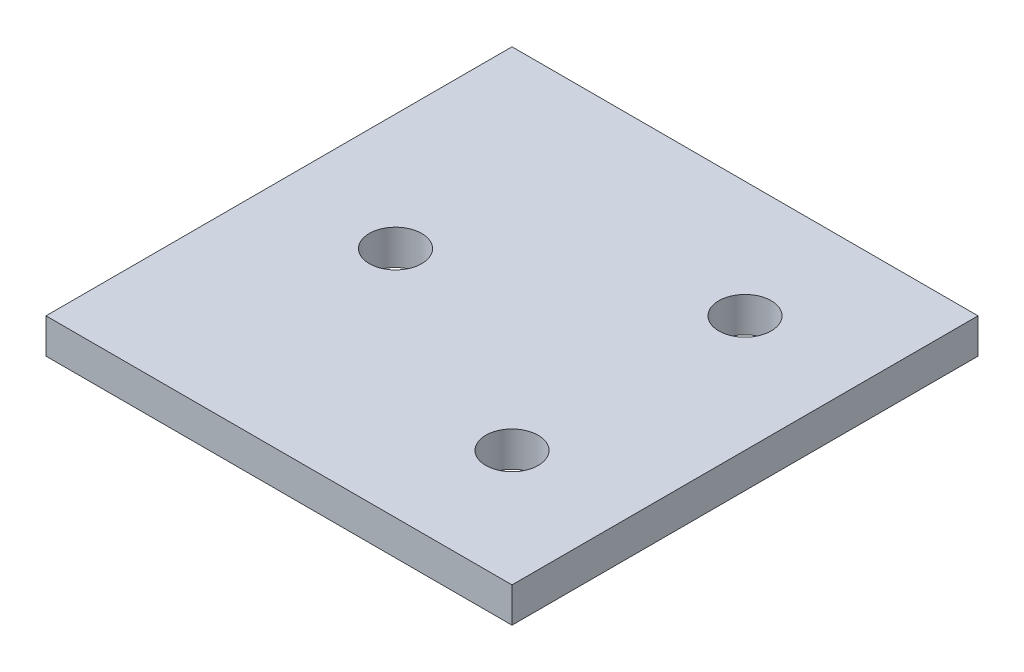
ISO-10303-21;
HEADER;
FILE_DESCRIPTION(('STEP AP214'),'2;1');
FILE_NAME('part.step','',(''),(''),'','','');
FILE_SCHEMA(('AUTOMOTIVE_DESIGN { 1 0 10303 214 1 1 1 1 }'));
ENDSEC;
DATA;
#1=APPLICATION_CONTEXT('core data for automotive mechanical design processes');
#2=APPLICATION_PROTOCOL_DEFINITION('international standard','automotive_design',2000,#1);
#3=PRODUCT_CONTEXT('',#1,'mechanical');
#4=PRODUCT('Part','Part','',(#3));
#5=PRODUCT_RELATED_PRODUCT_CATEGORY('part','',(#4));
#6=PRODUCT_DEFINITION_FORMATION('','',#4);
#7=PRODUCT_DEFINITION_CONTEXT('part definition',#1,'design');
#8=PRODUCT_DEFINITION('design','',#6,#7);
#9=PRODUCT_DEFINITION_SHAPE('','',#8);
#10=(LENGTH_UNIT() NAMED_UNIT(*) SI_UNIT(.MILLI.,.METRE.));
#11=(NAMED_UNIT(*) PLANE_ANGLE_UNIT() SI_UNIT($,.RADIAN.));
#12=(NAMED_UNIT(*) SI_UNIT($,.STERADIAN.) SOLID_ANGLE_UNIT());
#13=UNCERTAINTY_MEASURE_WITH_UNIT(LENGTH_MEASURE(1.E-05),#10,'distance_accuracy_value','');
#14=(GEOMETRIC_REPRESENTATION_CONTEXT(3) GLOBAL_UNCERTAINTY_ASSIGNED_CONTEXT((#13)) GLOBAL_UNIT_ASSIGNED_CONTEXT((#10,
#11,#12)) REPRESENTATION_CONTEXT('',''));
#15=CARTESIAN_POINT('',(0.,0.,0.));
#16=DIRECTION('',(0.,0.,1.));
#17=DIRECTION('',(1.,0.,0.));
#18=AXIS2_PLACEMENT_3D('',#15,#16,#17);
#19=CARTESIAN_POINT('',(80.,0.003099999999904,0.));
#20=DIRECTION('',(0.,1.,0.));
#21=DIRECTION('',(0.,0.,1.));
#22=AXIS2_PLACEMENT_3D('',#19,#20,#21);
#23=PLANE('',#22);
#24=CARTESIAN_POINT('',(60.,0.003100000000018,60.));
#25=DIRECTION('',(0.,1.,0.));
#26=DIRECTION('',(0.,0.,1.));
#27=AXIS2_PLACEMENT_3D('',#24,#25,#26);
#28=CIRCLE('',#27,4.5);
#29=CARTESIAN_POINT('',(60.,0.003100000000018,64.5));
#30=VERTEX_POINT('',#29);
#31=EDGE_CURVE('E87',#30,#30,#28,.T.);
#32=ORIENTED_EDGE('',*,*,#31,.T.);
#33=EDGE_LOOP('',(#32));
#34=FACE_BOUND('',#33,.T.);
#35=CARTESIAN_POINT('',(20.,0.003100000000018,40.));
#36=DIRECTION('',(0.,1.,0.));
#37=DIRECTION('',(0.,0.,1.));
#38=AXIS2_PLACEMENT_3D('',#35,#36,#37);
#39=CIRCLE('',#38,4.5);
#40=CARTESIAN_POINT('',(20.,0.003100000000018,44.5));
#41=VERTEX_POINT('',#40);
#42=EDGE_CURVE('E90',#41,#41,#39,.T.);
#43=ORIENTED_EDGE('',*,*,#42,.T.);
#44=EDGE_LOOP('',(#43));
#45=FACE_BOUND('',#44,.T.);
#46=CARTESIAN_POINT('',(60.,0.003100000000018,20.));
#47=DIRECTION('',(0.,1.,0.));
#48=DIRECTION('',(0.,0.,1.));
#49=AXIS2_PLACEMENT_3D('',#46,#47,#48);
#50=CIRCLE('',#49,4.5);
#51=CARTESIAN_POINT('',(60.,0.003100000000018,24.5));
#52=VERTEX_POINT('',#51);
#53=EDGE_CURVE('E19',#52,#52,#50,.T.);
#54=ORIENTED_EDGE('',*,*,#53,.T.);
#55=EDGE_LOOP('',(#54));
#56=FACE_BOUND('',#55,.T.);
#57=DIRECTION('',(0.,0.,1.));
#58=VECTOR('',#57,1.);
#59=CARTESIAN_POINT('',(0.,0.003100000000018,0.));
#60=LINE('',#59,#58);
#61=CARTESIAN_POINT('',(0.,0.0030999999999895,0.));
#62=VERTEX_POINT('',#61);
#63=CARTESIAN_POINT('',(0.,0.003099999999961,80.));
#64=VERTEX_POINT('',#63);
#65=EDGE_CURVE('E61',#62,#64,#60,.T.);
#66=ORIENTED_EDGE('',*,*,#65,.F.);
#67=DIRECTION('',(1.,0.,0.));
#68=VECTOR('',#67,1.);
#69=CARTESIAN_POINT('',(80.,0.003100000000018,0.));
#70=LINE('',#69,#68);
#71=CARTESIAN_POINT('',(80.,0.003099999999961,0.));
#72=VERTEX_POINT('',#71);
#73=EDGE_CURVE('E55',#62,#72,#70,.T.);
#74=ORIENTED_EDGE('',*,*,#73,.T.);
#75=DIRECTION('',(0.,0.,1.));
#76=VECTOR('',#75,1.);
#77=CARTESIAN_POINT('',(80.,0.003100000000018,0.));
#78=LINE('',#77,#76);
#79=CARTESIAN_POINT('',(80.,0.003099999999961,80.));
#80=VERTEX_POINT('',#79);
#81=EDGE_CURVE('E59',#72,#80,#78,.T.);
#82=ORIENTED_EDGE('',*,*,#81,.T.);
#83=DIRECTION('',(1.,0.,0.));
#84=VECTOR('',#83,1.);
#85=CARTESIAN_POINT('',(80.,0.003100000000018,80.));
#86=LINE('',#85,#84);
#87=EDGE_CURVE('E99',#64,#80,#86,.T.);
#88=ORIENTED_EDGE('',*,*,#87,.F.);
#89=EDGE_LOOP('',(#66,#74,#82,#88));
#90=FACE_BOUND('',#89,.T.);
#91=ADVANCED_FACE('F16',(#34,#45,#56,#90),#23,.F.);
#92=CARTESIAN_POINT('',(80.,0.003099999999904,0.));
#93=DIRECTION('',(-1.,0.,0.));
#94=DIRECTION('',(0.,0.,1.));
#95=AXIS2_PLACEMENT_3D('',#92,#93,#94);
#96=PLANE('',#95);
#97=DIRECTION('',(0.,1.,0.));
#98=VECTOR('',#97,1.);
#99=CARTESIAN_POINT('',(80.,0.003099999999904,80.));
#100=LINE('',#99,#98);
#101=CARTESIAN_POINT('',(80.,6.0031,80.));
#102=VERTEX_POINT('',#101);
#103=EDGE_CURVE('E69',#80,#102,#100,.T.);
#104=ORIENTED_EDGE('',*,*,#103,.F.);
#105=ORIENTED_EDGE('',*,*,#81,.F.);
#106=DIRECTION('',(0.,1.,0.));
#107=VECTOR('',#106,1.);
#108=CARTESIAN_POINT('',(80.,0.003099999999904,0.));
#109=LINE('',#108,#107);
#110=CARTESIAN_POINT('',(80.,6.0031,0.));
#111=VERTEX_POINT('',#110);
#112=EDGE_CURVE('E63',#72,#111,#109,.T.);
#113=ORIENTED_EDGE('',*,*,#112,.T.);
#114=DIRECTION('',(0.,0.,1.));
#115=VECTOR('',#114,1.);
#116=CARTESIAN_POINT('',(80.,6.0031,0.));
#117=LINE('',#116,#115);
#118=EDGE_CURVE('E89',#102,#111,#117,.F.);
#119=ORIENTED_EDGE('',*,*,#118,.F.);
#120=EDGE_LOOP('',(#104,#105,#113,#119));
#121=FACE_BOUND('',#120,.T.);
#122=ADVANCED_FACE('F66',(#121),#96,.F.);
#123=CARTESIAN_POINT('',(80.,0.003099999999904,0.));
#124=DIRECTION('',(0.,0.,1.));
#125=DIRECTION('',(1.,0.,0.));
#126=AXIS2_PLACEMENT_3D('',#123,#124,#125);
#127=PLANE('',#126);
#128=DIRECTION('',(1.,0.,0.));
#129=VECTOR('',#128,1.);
#130=CARTESIAN_POINT('',(80.,6.0031,0.));
#131=LINE('',#130,#129);
#132=CARTESIAN_POINT('',(0.,6.0031,0.));
#133=VERTEX_POINT('',#132);
#134=EDGE_CURVE('E74',#111,#133,#131,.F.);
#135=ORIENTED_EDGE('',*,*,#134,.F.);
#136=ORIENTED_EDGE('',*,*,#112,.F.);
#137=ORIENTED_EDGE('',*,*,#73,.F.);
#138=DIRECTION('',(0.,1.,0.));
#139=VECTOR('',#138,1.);
#140=CARTESIAN_POINT('',(0.,0.003099999999904,0.));
#141=LINE('',#140,#139);
#142=EDGE_CURVE('E76',#133,#62,#141,.F.);
#143=ORIENTED_EDGE('',*,*,#142,.F.);
#144=EDGE_LOOP('',(#135,#136,#137,#143));
#145=FACE_BOUND('',#144,.T.);
#146=ADVANCED_FACE('F72',(#145),#127,.F.);
#147=CARTESIAN_POINT('',(0.,0.003099999999904,0.));
#148=DIRECTION('',(-1.,0.,0.));
#149=DIRECTION('',(0.,0.,1.));
#150=AXIS2_PLACEMENT_3D('',#147,#148,#149);
#151=PLANE('',#150);
#152=DIRECTION('',(0.,1.,0.));
#153=VECTOR('',#152,1.);
#154=CARTESIAN_POINT('',(0.,0.003099999999904,80.));
#155=LINE('',#154,#153);
#156=CARTESIAN_POINT('',(0.,6.0031,80.));
#157=VERTEX_POINT('',#156);
#158=EDGE_CURVE('E34',#157,#64,#155,.F.);
#159=ORIENTED_EDGE('',*,*,#158,.F.);
#160=DIRECTION('',(0.,0.,1.));
#161=VECTOR('',#160,1.);
#162=CARTESIAN_POINT('',(0.,6.0031,0.));
#163=LINE('',#162,#161);
#164=EDGE_CURVE('E106',#133,#157,#163,.T.);
#165=ORIENTED_EDGE('',*,*,#164,.F.);
#166=ORIENTED_EDGE('',*,*,#142,.T.);
#167=ORIENTED_EDGE('',*,*,#65,.T.);
#168=EDGE_LOOP('',(#159,#165,#166,#167));
#169=FACE_BOUND('',#168,.T.);
#170=ADVANCED_FACE('F104',(#169),#151,.T.);
#171=CARTESIAN_POINT('',(80.,0.003099999999904,80.));
#172=DIRECTION('',(0.,0.,1.));
#173=DIRECTION('',(1.,0.,0.));
#174=AXIS2_PLACEMENT_3D('',#171,#172,#173);
#175=PLANE('',#174);
#176=DIRECTION('',(1.,0.,0.));
#177=VECTOR('',#176,1.);
#178=CARTESIAN_POINT('',(80.,6.0031,80.));
#179=LINE('',#178,#177);
#180=EDGE_CURVE('E86',#157,#102,#179,.T.);
#181=ORIENTED_EDGE('',*,*,#180,.F.);
#182=ORIENTED_EDGE('',*,*,#158,.T.);
#183=ORIENTED_EDGE('',*,*,#87,.T.);
#184=ORIENTED_EDGE('',*,*,#103,.T.);
#185=EDGE_LOOP('',(#181,#182,#183,#184));
#186=FACE_BOUND('',#185,.T.);
#187=ADVANCED_FACE('F112',(#186),#175,.T.);
#188=CARTESIAN_POINT('',(60.,0.003099999999904,20.));
#189=DIRECTION('',(0.,1.,0.));
#190=DIRECTION('',(0.,0.,1.));
#191=AXIS2_PLACEMENT_3D('',#188,#189,#190);
#192=CYLINDRICAL_SURFACE('',#191,4.5);
#193=ORIENTED_EDGE('',*,*,#53,.F.);
#194=EDGE_LOOP('',(#193));
#195=FACE_BOUND('',#194,.T.);
#196=CARTESIAN_POINT('',(60.,6.0031,20.));
#197=DIRECTION('',(0.,1.,0.));
#198=DIRECTION('',(0.,0.,1.));
#199=AXIS2_PLACEMENT_3D('',#196,#197,#198);
#200=CIRCLE('',#199,4.5);
#201=CARTESIAN_POINT('',(60.,6.0031,24.5));
#202=VERTEX_POINT('',#201);
#203=EDGE_CURVE('E83',#202,#202,#200,.F.);
#204=ORIENTED_EDGE('',*,*,#203,.F.);
#205=EDGE_LOOP('',(#204));
#206=FACE_BOUND('',#205,.T.);
#207=ADVANCED_FACE('F114',(#195,#206),#192,.F.);
#208=CARTESIAN_POINT('',(20.,0.003099999999904,40.));
#209=DIRECTION('',(0.,1.,0.));
#210=DIRECTION('',(0.,0.,1.));
#211=AXIS2_PLACEMENT_3D('',#208,#209,#210);
#212=CYLINDRICAL_SURFACE('',#211,4.5);
#213=ORIENTED_EDGE('',*,*,#42,.F.);
#214=EDGE_LOOP('',(#213));
#215=FACE_BOUND('',#214,.T.);
#216=CARTESIAN_POINT('',(20.,6.0031,40.));
#217=DIRECTION('',(0.,1.,0.));
#218=DIRECTION('',(0.,0.,1.));
#219=AXIS2_PLACEMENT_3D('',#216,#217,#218);
#220=CIRCLE('',#219,4.5);
#221=CARTESIAN_POINT('',(20.,6.0031,44.5));
#222=VERTEX_POINT('',#221);
#223=EDGE_CURVE('E25',#222,#222,#220,.F.);
#224=ORIENTED_EDGE('',*,*,#223,.F.);
#225=EDGE_LOOP('',(#224));
#226=FACE_BOUND('',#225,.T.);
#227=ADVANCED_FACE('F121',(#215,#226),#212,.F.);
#228=CARTESIAN_POINT('',(60.,0.003099999999904,60.));
#229=DIRECTION('',(0.,1.,0.));
#230=DIRECTION('',(0.,0.,1.));
#231=AXIS2_PLACEMENT_3D('',#228,#229,#230);
#232=CYLINDRICAL_SURFACE('',#231,4.5);
#233=ORIENTED_EDGE('',*,*,#31,.F.);
#234=EDGE_LOOP('',(#233));
#235=FACE_BOUND('',#234,.T.);
#236=CARTESIAN_POINT('',(60.,6.0031,60.));
#237=DIRECTION('',(0.,1.,0.));
#238=DIRECTION('',(0.,0.,1.));
#239=AXIS2_PLACEMENT_3D('',#236,#237,#238);
#240=CIRCLE('',#239,4.5);
#241=CARTESIAN_POINT('',(60.,6.0031,64.5));
#242=VERTEX_POINT('',#241);
#243=EDGE_CURVE('E11',#242,#242,#240,.F.);
#244=ORIENTED_EDGE('',*,*,#243,.F.);
#245=EDGE_LOOP('',(#244));
#246=FACE_BOUND('',#245,.T.);
#247=ADVANCED_FACE('F126',(#235,#246),#232,.F.);
#248=CARTESIAN_POINT('',(80.,6.0031,0.));
#249=DIRECTION('',(0.,1.,0.));
#250=DIRECTION('',(0.,0.,1.));
#251=AXIS2_PLACEMENT_3D('',#248,#249,#250);
#252=PLANE('',#251);
#253=ORIENTED_EDGE('',*,*,#243,.T.);
#254=EDGE_LOOP('',(#253));
#255=FACE_BOUND('',#254,.T.);
#256=ORIENTED_EDGE('',*,*,#223,.T.);
#257=EDGE_LOOP('',(#256));
#258=FACE_BOUND('',#257,.T.);
#259=ORIENTED_EDGE('',*,*,#203,.T.);
#260=EDGE_LOOP('',(#259));
#261=FACE_BOUND('',#260,.T.);
#262=ORIENTED_EDGE('',*,*,#164,.T.);
#263=ORIENTED_EDGE('',*,*,#180,.T.);
#264=ORIENTED_EDGE('',*,*,#118,.T.);
#265=ORIENTED_EDGE('',*,*,#134,.T.);
#266=EDGE_LOOP('',(#262,#263,#264,#265));
#267=FACE_BOUND('',#266,.T.);
#268=ADVANCED_FACE('F110',(#255,#258,#261,#267),#252,.T.);
#269=CLOSED_SHELL('',(#91,#122,#146,#170,#187,#207,#227,#247,#268));
#270=MANIFOLD_SOLID_BREP('B1',#269);
#271=ADVANCED_BREP_SHAPE_REPRESENTATION('',(#18,#270),#14);
#272=SHAPE_DEFINITION_REPRESENTATION(#9,#271);
ENDSEC;
END-ISO-10303-21;
